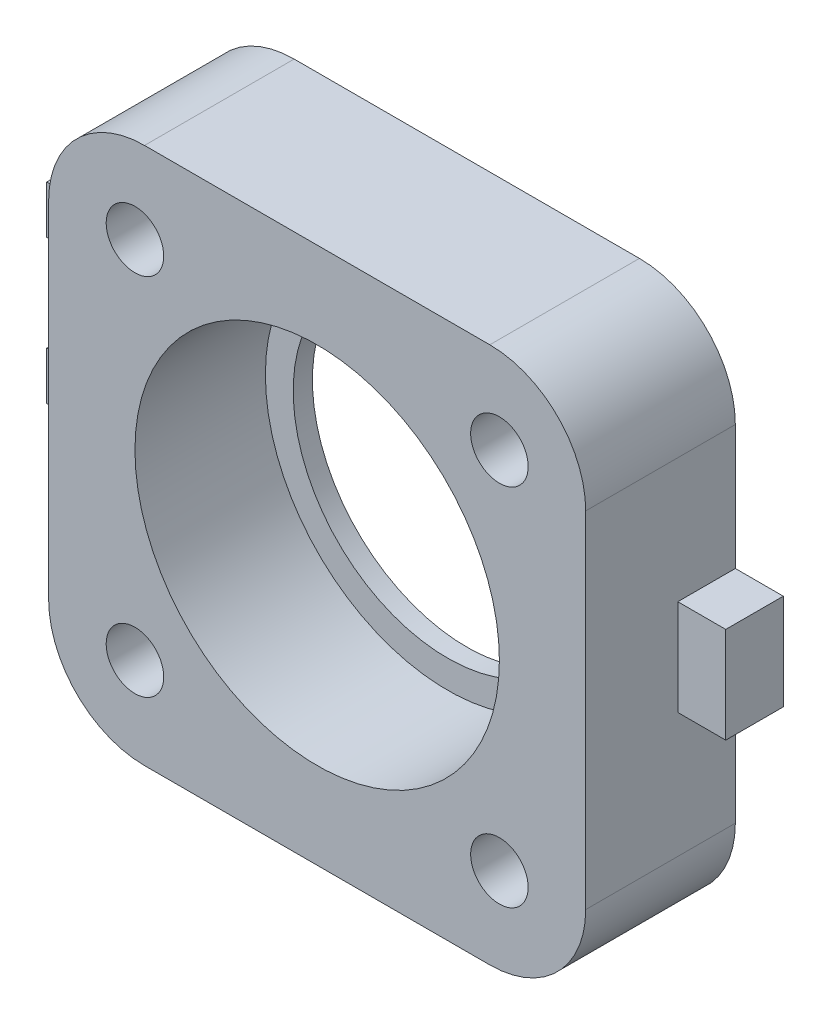
ISO-10303-21;
HEADER;
FILE_DESCRIPTION(('STEP AP214'),'2;1');
FILE_NAME('part.step','',(''),(''),'','','');
FILE_SCHEMA(('AUTOMOTIVE_DESIGN { 1 0 10303 214 1 1 1 1 }'));
ENDSEC;
DATA;
#1=APPLICATION_CONTEXT('core data for automotive mechanical design processes');
#2=APPLICATION_PROTOCOL_DEFINITION('international standard','automotive_design',2000,#1);
#3=PRODUCT_CONTEXT('',#1,'mechanical');
#4=PRODUCT('Part','Part','',(#3));
#5=PRODUCT_RELATED_PRODUCT_CATEGORY('part','',(#4));
#6=PRODUCT_DEFINITION_FORMATION('','',#4);
#7=PRODUCT_DEFINITION_CONTEXT('part definition',#1,'design');
#8=PRODUCT_DEFINITION('design','',#6,#7);
#9=PRODUCT_DEFINITION_SHAPE('','',#8);
#10=(LENGTH_UNIT() NAMED_UNIT(*) SI_UNIT(.MILLI.,.METRE.));
#11=(NAMED_UNIT(*) PLANE_ANGLE_UNIT() SI_UNIT($,.RADIAN.));
#12=(NAMED_UNIT(*) SI_UNIT($,.STERADIAN.) SOLID_ANGLE_UNIT());
#13=UNCERTAINTY_MEASURE_WITH_UNIT(LENGTH_MEASURE(1.E-05),#10,'distance_accuracy_value','');
#14=(GEOMETRIC_REPRESENTATION_CONTEXT(3) GLOBAL_UNCERTAINTY_ASSIGNED_CONTEXT((#13)) GLOBAL_UNIT_ASSIGNED_CONTEXT((#10,
#11,#12)) REPRESENTATION_CONTEXT('',''));
#15=CARTESIAN_POINT('',(0.,0.,0.));
#16=DIRECTION('',(0.,0.,1.));
#17=DIRECTION('',(1.,0.,0.));
#18=AXIS2_PLACEMENT_3D('',#15,#16,#17);
#19=CARTESIAN_POINT('',(-14.,-14.,0.5));
#20=DIRECTION('',(1.,0.,0.));
#21=DIRECTION('',(0.,0.,-1.));
#22=AXIS2_PLACEMENT_3D('',#19,#20,#21);
#23=PLANE('',#22);
#24=DIRECTION('',(0.,-1.,0.));
#25=VECTOR('',#24,1.);
#26=CARTESIAN_POINT('',(-14.,-14.,-0.5));
#27=LINE('',#26,#25);
#28=CARTESIAN_POINT('',(-14.,-5.,-0.5));
#29=VERTEX_POINT('',#28);
#30=CARTESIAN_POINT('',(-14.,-9.,-0.5));
#31=VERTEX_POINT('',#30);
#32=EDGE_CURVE('E421',#29,#31,#27,.T.);
#33=ORIENTED_EDGE('',*,*,#32,.T.);
#34=DIRECTION('',(0.,0.,-1.));
#35=VECTOR('',#34,1.);
#36=CARTESIAN_POINT('',(-14.,-9.,0.5));
#37=LINE('',#36,#35);
#38=CARTESIAN_POINT('',(-14.,-9.,7.3));
#39=VERTEX_POINT('',#38);
#40=EDGE_CURVE('E452',#31,#39,#37,.F.);
#41=ORIENTED_EDGE('',*,*,#40,.T.);
#42=DIRECTION('',(0.,-1.,0.));
#43=VECTOR('',#42,1.);
#44=CARTESIAN_POINT('',(-14.,14.,7.3));
#45=LINE('',#44,#43);
#46=CARTESIAN_POINT('',(-14.,9.,7.3));
#47=VERTEX_POINT('',#46);
#48=EDGE_CURVE('E402',#47,#39,#45,.T.);
#49=ORIENTED_EDGE('',*,*,#48,.F.);
#50=DIRECTION('',(0.,0.,-1.));
#51=VECTOR('',#50,1.);
#52=CARTESIAN_POINT('',(-14.,9.,0.5));
#53=LINE('',#52,#51);
#54=CARTESIAN_POINT('',(-14.,9.,-0.5));
#55=VERTEX_POINT('',#54);
#56=EDGE_CURVE('E448',#47,#55,#53,.T.);
#57=ORIENTED_EDGE('',*,*,#56,.T.);
#58=CARTESIAN_POINT('',(-14.,5.,-0.5));
#59=VERTEX_POINT('',#58);
#60=EDGE_CURVE('E422',#55,#59,#27,.T.);
#61=ORIENTED_EDGE('',*,*,#60,.T.);
#62=DIRECTION('',(0.,0.,-1.));
#63=VECTOR('',#62,1.);
#64=CARTESIAN_POINT('',(-14.,5.,2.5));
#65=LINE('',#64,#63);
#66=CARTESIAN_POINT('',(-14.,5.,2.5));
#67=VERTEX_POINT('',#66);
#68=EDGE_CURVE('E293',#67,#59,#65,.T.);
#69=ORIENTED_EDGE('',*,*,#68,.F.);
#70=DIRECTION('',(0.,1.,0.));
#71=VECTOR('',#70,1.);
#72=CARTESIAN_POINT('',(-14.,0.,2.5));
#73=LINE('',#72,#71);
#74=CARTESIAN_POINT('',(-14.,-5.,2.5));
#75=VERTEX_POINT('',#74);
#76=EDGE_CURVE('E254',#75,#67,#73,.T.);
#77=ORIENTED_EDGE('',*,*,#76,.F.);
#78=DIRECTION('',(0.,0.,-1.));
#79=VECTOR('',#78,1.);
#80=CARTESIAN_POINT('',(-14.,-5.,2.5));
#81=LINE('',#80,#79);
#82=EDGE_CURVE('E289',#75,#29,#81,.T.);
#83=ORIENTED_EDGE('',*,*,#82,.T.);
#84=EDGE_LOOP('',(#33,#41,#49,#57,#61,#69,#77,#83));
#85=FACE_BOUND('',#84,.T.);
#86=ADVANCED_FACE('F41',(#85),#23,.F.);
#87=CARTESIAN_POINT('',(-14.,-14.,0.5));
#88=DIRECTION('',(0.,1.,0.));
#89=DIRECTION('',(0.,0.,1.));
#90=AXIS2_PLACEMENT_3D('',#87,#88,#89);
#91=PLANE('',#90);
#92=DIRECTION('',(1.,0.,0.));
#93=VECTOR('',#92,1.);
#94=CARTESIAN_POINT('',(-14.,-14.,7.3));
#95=LINE('',#94,#93);
#96=CARTESIAN_POINT('',(-9.,-14.,7.3));
#97=VERTEX_POINT('',#96);
#98=CARTESIAN_POINT('',(9.,-14.,7.3));
#99=VERTEX_POINT('',#98);
#100=EDGE_CURVE('E389',#97,#99,#95,.T.);
#101=ORIENTED_EDGE('',*,*,#100,.F.);
#102=DIRECTION('',(0.,0.,-1.));
#103=VECTOR('',#102,1.);
#104=CARTESIAN_POINT('',(-9.,-14.,0.5));
#105=LINE('',#104,#103);
#106=CARTESIAN_POINT('',(-9.,-14.,-0.5));
#107=VERTEX_POINT('',#106);
#108=EDGE_CURVE('E432',#97,#107,#105,.T.);
#109=ORIENTED_EDGE('',*,*,#108,.T.);
#110=DIRECTION('',(1.,0.,0.));
#111=VECTOR('',#110,1.);
#112=CARTESIAN_POINT('',(-14.,-14.,-0.5));
#113=LINE('',#112,#111);
#114=CARTESIAN_POINT('',(-5.,-14.,-0.5));
#115=VERTEX_POINT('',#114);
#116=EDGE_CURVE('E426',#107,#115,#113,.T.);
#117=ORIENTED_EDGE('',*,*,#116,.T.);
#118=DIRECTION('',(0.,0.,-1.));
#119=VECTOR('',#118,1.);
#120=CARTESIAN_POINT('',(-5.,-14.,2.5));
#121=LINE('',#120,#119);
#122=CARTESIAN_POINT('',(-5.,-14.,2.5));
#123=VERTEX_POINT('',#122);
#124=EDGE_CURVE('E320',#123,#115,#121,.T.);
#125=ORIENTED_EDGE('',*,*,#124,.F.);
#126=DIRECTION('',(-1.,0.,0.));
#127=VECTOR('',#126,1.);
#128=CARTESIAN_POINT('',(0.,-14.,2.5));
#129=LINE('',#128,#127);
#130=CARTESIAN_POINT('',(5.,-14.,2.5));
#131=VERTEX_POINT('',#130);
#132=EDGE_CURVE('E308',#131,#123,#129,.T.);
#133=ORIENTED_EDGE('',*,*,#132,.F.);
#134=DIRECTION('',(0.,0.,-1.));
#135=VECTOR('',#134,1.);
#136=CARTESIAN_POINT('',(5.,-14.,2.5));
#137=LINE('',#136,#135);
#138=CARTESIAN_POINT('',(5.,-14.,-0.5));
#139=VERTEX_POINT('',#138);
#140=EDGE_CURVE('E338',#131,#139,#137,.T.);
#141=ORIENTED_EDGE('',*,*,#140,.T.);
#142=CARTESIAN_POINT('',(9.,-14.,-0.5));
#143=VERTEX_POINT('',#142);
#144=EDGE_CURVE('E425',#139,#143,#113,.T.);
#145=ORIENTED_EDGE('',*,*,#144,.T.);
#146=DIRECTION('',(0.,0.,-1.));
#147=VECTOR('',#146,1.);
#148=CARTESIAN_POINT('',(9.,-14.,0.5));
#149=LINE('',#148,#147);
#150=EDGE_CURVE('E429',#143,#99,#149,.F.);
#151=ORIENTED_EDGE('',*,*,#150,.T.);
#152=EDGE_LOOP('',(#101,#109,#117,#125,#133,#141,#145,#151));
#153=FACE_BOUND('',#152,.T.);
#154=ADVANCED_FACE('F528',(#153),#91,.F.);
#155=CARTESIAN_POINT('',(14.,-14.,0.5));
#156=DIRECTION('',(-1.,0.,0.));
#157=DIRECTION('',(0.,0.,1.));
#158=AXIS2_PLACEMENT_3D('',#155,#156,#157);
#159=PLANE('',#158);
#160=DIRECTION('',(0.,1.,0.));
#161=VECTOR('',#160,1.);
#162=CARTESIAN_POINT('',(14.,-14.,7.3));
#163=LINE('',#162,#161);
#164=CARTESIAN_POINT('',(14.,-9.,7.3));
#165=VERTEX_POINT('',#164);
#166=CARTESIAN_POINT('',(14.,9.,7.3));
#167=VERTEX_POINT('',#166);
#168=EDGE_CURVE('E396',#165,#167,#163,.T.);
#169=ORIENTED_EDGE('',*,*,#168,.F.);
#170=DIRECTION('',(0.,0.,-1.));
#171=VECTOR('',#170,1.);
#172=CARTESIAN_POINT('',(14.,-9.,0.5));
#173=LINE('',#172,#171);
#174=CARTESIAN_POINT('',(14.,-9.,-0.5));
#175=VERTEX_POINT('',#174);
#176=EDGE_CURVE('E469',#165,#175,#173,.T.);
#177=ORIENTED_EDGE('',*,*,#176,.T.);
#178=DIRECTION('',(0.,1.,0.));
#179=VECTOR('',#178,1.);
#180=CARTESIAN_POINT('',(14.,-14.,-0.5));
#181=LINE('',#180,#179);
#182=CARTESIAN_POINT('',(14.,-2.5,-0.5));
#183=VERTEX_POINT('',#182);
#184=EDGE_CURVE('E415',#175,#183,#181,.T.);
#185=ORIENTED_EDGE('',*,*,#184,.T.);
#186=DIRECTION('',(0.,0.,-1.));
#187=VECTOR('',#186,1.);
#188=CARTESIAN_POINT('',(14.,-2.5,2.5));
#189=LINE('',#188,#187);
#190=CARTESIAN_POINT('',(14.,-2.5,2.5));
#191=VERTEX_POINT('',#190);
#192=EDGE_CURVE('E376',#191,#183,#189,.T.);
#193=ORIENTED_EDGE('',*,*,#192,.F.);
#194=DIRECTION('',(0.,-1.,0.));
#195=VECTOR('',#194,1.);
#196=CARTESIAN_POINT('',(14.,0.,2.5));
#197=LINE('',#196,#195);
#198=CARTESIAN_POINT('',(14.,2.5,2.5));
#199=VERTEX_POINT('',#198);
#200=EDGE_CURVE('E357',#199,#191,#197,.T.);
#201=ORIENTED_EDGE('',*,*,#200,.F.);
#202=DIRECTION('',(0.,0.,-1.));
#203=VECTOR('',#202,1.);
#204=CARTESIAN_POINT('',(14.,2.5,2.5));
#205=LINE('',#204,#203);
#206=CARTESIAN_POINT('',(14.,2.5,-0.5));
#207=VERTEX_POINT('',#206);
#208=EDGE_CURVE('E371',#199,#207,#205,.T.);
#209=ORIENTED_EDGE('',*,*,#208,.T.);
#210=CARTESIAN_POINT('',(14.,9.,-0.5));
#211=VERTEX_POINT('',#210);
#212=EDGE_CURVE('E411',#207,#211,#181,.T.);
#213=ORIENTED_EDGE('',*,*,#212,.T.);
#214=DIRECTION('',(0.,0.,-1.));
#215=VECTOR('',#214,1.);
#216=CARTESIAN_POINT('',(14.,9.,0.5));
#217=LINE('',#216,#215);
#218=EDGE_CURVE('E466',#211,#167,#217,.F.);
#219=ORIENTED_EDGE('',*,*,#218,.T.);
#220=EDGE_LOOP('',(#169,#177,#185,#193,#201,#209,#213,#219));
#221=FACE_BOUND('',#220,.T.);
#222=ADVANCED_FACE('F518',(#221),#159,.F.);
#223=CARTESIAN_POINT('',(0.,0.,0.5));
#224=DIRECTION('',(0.,0.,-1.));
#225=DIRECTION('',(-1.,0.,0.));
#226=AXIS2_PLACEMENT_3D('',#223,#224,#225);
#227=PLANE('',#226);
#228=CARTESIAN_POINT('',(0.,0.,0.5));
#229=DIRECTION('',(0.,0.,1.));
#230=DIRECTION('',(1.,0.,0.));
#231=AXIS2_PLACEMENT_3D('',#228,#229,#230);
#232=CIRCLE('',#231,8.05);
#233=CARTESIAN_POINT('',(8.05,0.,0.5));
#234=VERTEX_POINT('',#233);
#235=EDGE_CURVE('E407',#234,#234,#232,.T.);
#236=ORIENTED_EDGE('',*,*,#235,.F.);
#237=EDGE_LOOP('',(#236));
#238=FACE_BOUND('',#237,.T.);
#239=CARTESIAN_POINT('',(0.,0.,0.5));
#240=DIRECTION('',(0.,0.,1.));
#241=DIRECTION('',(1.,0.,0.));
#242=AXIS2_PLACEMENT_3D('',#239,#240,#241);
#243=CIRCLE('',#242,9.5);
#244=CARTESIAN_POINT('',(9.5,0.,0.5));
#245=VERTEX_POINT('',#244);
#246=EDGE_CURVE('E375',#245,#245,#243,.T.);
#247=ORIENTED_EDGE('',*,*,#246,.T.);
#248=EDGE_LOOP('',(#247));
#249=FACE_BOUND('',#248,.T.);
#250=ADVANCED_FACE('F515',(#238,#249),#227,.F.);
#251=CARTESIAN_POINT('',(0.,0.,-0.5));
#252=DIRECTION('',(0.,0.,-1.));
#253=DIRECTION('',(-1.,0.,0.));
#254=AXIS2_PLACEMENT_3D('',#251,#252,#253);
#255=PLANE('',#254);
#256=CARTESIAN_POINT('',(9.49999999999999,-9.50000000000001,-0.5));
#257=DIRECTION('',(0.,0.,-1.));
#258=DIRECTION('',(-1.,0.,0.));
#259=AXIS2_PLACEMENT_3D('',#256,#257,#258);
#260=CIRCLE('',#259,1.5);
#261=CARTESIAN_POINT('',(7.99999999999999,-9.50000000000001,-0.5));
#262=VERTEX_POINT('',#261);
#263=EDGE_CURVE('E888',#262,#262,#260,.T.);
#264=ORIENTED_EDGE('',*,*,#263,.F.);
#265=EDGE_LOOP('',(#264));
#266=FACE_BOUND('',#265,.T.);
#267=CARTESIAN_POINT('',(-9.5,-9.5,-0.5));
#268=DIRECTION('',(0.,0.,-1.));
#269=DIRECTION('',(-1.,0.,0.));
#270=AXIS2_PLACEMENT_3D('',#267,#268,#269);
#271=CIRCLE('',#270,1.5);
#272=CARTESIAN_POINT('',(-11.,-9.5,-0.5));
#273=VERTEX_POINT('',#272);
#274=EDGE_CURVE('E884',#273,#273,#271,.T.);
#275=ORIENTED_EDGE('',*,*,#274,.F.);
#276=EDGE_LOOP('',(#275));
#277=FACE_BOUND('',#276,.T.);
#278=CARTESIAN_POINT('',(-9.5,9.5,-0.5));
#279=DIRECTION('',(0.,0.,-1.));
#280=DIRECTION('',(-1.,0.,0.));
#281=AXIS2_PLACEMENT_3D('',#278,#279,#280);
#282=CIRCLE('',#281,1.5);
#283=CARTESIAN_POINT('',(-11.,9.5,-0.5));
#284=VERTEX_POINT('',#283);
#285=EDGE_CURVE('E887',#284,#284,#282,.T.);
#286=ORIENTED_EDGE('',*,*,#285,.F.);
#287=EDGE_LOOP('',(#286));
#288=FACE_BOUND('',#287,.T.);
#289=CARTESIAN_POINT('',(9.5,9.49999999999999,-0.5));
#290=DIRECTION('',(0.,0.,-1.));
#291=DIRECTION('',(-1.,0.,0.));
#292=AXIS2_PLACEMENT_3D('',#289,#290,#291);
#293=CIRCLE('',#292,1.5);
#294=CARTESIAN_POINT('',(8.,9.49999999999999,-0.5));
#295=VERTEX_POINT('',#294);
#296=EDGE_CURVE('E242',#295,#295,#293,.T.);
#297=ORIENTED_EDGE('',*,*,#296,.F.);
#298=EDGE_LOOP('',(#297));
#299=FACE_BOUND('',#298,.T.);
#300=ORIENTED_EDGE('',*,*,#116,.F.);
#301=CARTESIAN_POINT('',(-9.,-9.,-0.5));
#302=DIRECTION('',(0.,0.,-1.));
#303=DIRECTION('',(-1.,0.,0.));
#304=AXIS2_PLACEMENT_3D('',#301,#302,#303);
#305=CIRCLE('',#304,5.);
#306=EDGE_CURVE('E445',#107,#31,#305,.T.);
#307=ORIENTED_EDGE('',*,*,#306,.T.);
#308=ORIENTED_EDGE('',*,*,#32,.F.);
#309=DIRECTION('',(-1.,0.,0.));
#310=VECTOR('',#309,1.);
#311=CARTESIAN_POINT('',(0.,-5.,-0.5));
#312=LINE('',#311,#310);
#313=CARTESIAN_POINT('',(-18.9,-5.,-0.5));
#314=VERTEX_POINT('',#313);
#315=EDGE_CURVE('E239',#29,#314,#312,.T.);
#316=ORIENTED_EDGE('',*,*,#315,.T.);
#317=DIRECTION('',(0.,-1.,0.));
#318=VECTOR('',#317,1.);
#319=CARTESIAN_POINT('',(-18.9,0.,-0.5));
#320=LINE('',#319,#318);
#321=CARTESIAN_POINT('',(-18.9,-2.5,-0.5));
#322=VERTEX_POINT('',#321);
#323=EDGE_CURVE('E235',#322,#314,#320,.T.);
#324=ORIENTED_EDGE('',*,*,#323,.F.);
#325=DIRECTION('',(-1.,0.,0.));
#326=VECTOR('',#325,1.);
#327=CARTESIAN_POINT('',(0.,-2.5,-0.5));
#328=LINE('',#327,#326);
#329=CARTESIAN_POINT('',(-16.5,-2.5,-0.5));
#330=VERTEX_POINT('',#329);
#331=EDGE_CURVE('E263',#330,#322,#328,.T.);
#332=ORIENTED_EDGE('',*,*,#331,.F.);
#333=DIRECTION('',(0.,-1.,0.));
#334=VECTOR('',#333,1.);
#335=CARTESIAN_POINT('',(-16.5,0.,-0.5));
#336=LINE('',#335,#334);
#337=CARTESIAN_POINT('',(-16.5,2.5,-0.5));
#338=VERTEX_POINT('',#337);
#339=EDGE_CURVE('E223',#338,#330,#336,.T.);
#340=ORIENTED_EDGE('',*,*,#339,.F.);
#341=DIRECTION('',(-1.,0.,0.));
#342=VECTOR('',#341,1.);
#343=CARTESIAN_POINT('',(0.,2.5,-0.5));
#344=LINE('',#343,#342);
#345=CARTESIAN_POINT('',(-18.9,2.5,-0.5));
#346=VERTEX_POINT('',#345);
#347=EDGE_CURVE('E268',#338,#346,#344,.T.);
#348=ORIENTED_EDGE('',*,*,#347,.T.);
#349=DIRECTION('',(0.,1.,0.));
#350=VECTOR('',#349,1.);
#351=CARTESIAN_POINT('',(-18.9,0.,-0.5));
#352=LINE('',#351,#350);
#353=CARTESIAN_POINT('',(-18.9,5.,-0.5));
#354=VERTEX_POINT('',#353);
#355=EDGE_CURVE('E272',#346,#354,#352,.T.);
#356=ORIENTED_EDGE('',*,*,#355,.T.);
#357=DIRECTION('',(-1.,0.,0.));
#358=VECTOR('',#357,1.);
#359=CARTESIAN_POINT('',(0.,5.,-0.5));
#360=LINE('',#359,#358);
#361=EDGE_CURVE('E276',#59,#354,#360,.T.);
#362=ORIENTED_EDGE('',*,*,#361,.F.);
#363=ORIENTED_EDGE('',*,*,#60,.F.);
#364=CARTESIAN_POINT('',(-9.,9.,-0.5));
#365=DIRECTION('',(0.,0.,-1.));
#366=DIRECTION('',(-1.,0.,0.));
#367=AXIS2_PLACEMENT_3D('',#364,#365,#366);
#368=CIRCLE('',#367,5.);
#369=CARTESIAN_POINT('',(-9.,14.,-0.5));
#370=VERTEX_POINT('',#369);
#371=EDGE_CURVE('E436',#55,#370,#368,.T.);
#372=ORIENTED_EDGE('',*,*,#371,.T.);
#373=DIRECTION('',(-1.,0.,0.));
#374=VECTOR('',#373,1.);
#375=CARTESIAN_POINT('',(-14.,14.,-0.5));
#376=LINE('',#375,#374);
#377=CARTESIAN_POINT('',(9.,14.,-0.5));
#378=VERTEX_POINT('',#377);
#379=EDGE_CURVE('E418',#378,#370,#376,.T.);
#380=ORIENTED_EDGE('',*,*,#379,.F.);
#381=CARTESIAN_POINT('',(9.,9.,-0.5));
#382=DIRECTION('',(0.,0.,-1.));
#383=DIRECTION('',(-1.,0.,0.));
#384=AXIS2_PLACEMENT_3D('',#381,#382,#383);
#385=CIRCLE('',#384,5.);
#386=EDGE_CURVE('E439',#378,#211,#385,.T.);
#387=ORIENTED_EDGE('',*,*,#386,.T.);
#388=ORIENTED_EDGE('',*,*,#212,.F.);
#389=DIRECTION('',(1.,0.,0.));
#390=VECTOR('',#389,1.);
#391=CARTESIAN_POINT('',(0.,2.50000000000003,-0.5));
#392=LINE('',#391,#390);
#393=CARTESIAN_POINT('',(16.5,2.5,-0.5));
#394=VERTEX_POINT('',#393);
#395=EDGE_CURVE('E334',#207,#394,#392,.T.);
#396=ORIENTED_EDGE('',*,*,#395,.T.);
#397=DIRECTION('',(0.,-1.,0.));
#398=VECTOR('',#397,1.);
#399=CARTESIAN_POINT('',(16.5,0.,-0.5));
#400=LINE('',#399,#398);
#401=CARTESIAN_POINT('',(16.5,-2.5,-0.5));
#402=VERTEX_POINT('',#401);
#403=EDGE_CURVE('E364',#394,#402,#400,.T.);
#404=ORIENTED_EDGE('',*,*,#403,.T.);
#405=DIRECTION('',(1.,0.,0.));
#406=VECTOR('',#405,1.);
#407=CARTESIAN_POINT('',(0.,-2.5,-0.5));
#408=LINE('',#407,#406);
#409=EDGE_CURVE('E350',#183,#402,#408,.T.);
#410=ORIENTED_EDGE('',*,*,#409,.F.);
#411=ORIENTED_EDGE('',*,*,#184,.F.);
#412=CARTESIAN_POINT('',(9.,-9.,-0.5));
#413=DIRECTION('',(0.,0.,-1.));
#414=DIRECTION('',(-1.,0.,0.));
#415=AXIS2_PLACEMENT_3D('',#412,#413,#414);
#416=CIRCLE('',#415,5.);
#417=EDGE_CURVE('E442',#175,#143,#416,.T.);
#418=ORIENTED_EDGE('',*,*,#417,.T.);
#419=ORIENTED_EDGE('',*,*,#144,.F.);
#420=DIRECTION('',(0.,-1.,0.));
#421=VECTOR('',#420,1.);
#422=CARTESIAN_POINT('',(5.,0.,-0.5));
#423=LINE('',#422,#421);
#424=CARTESIAN_POINT('',(4.99999999999999,-18.,-0.5));
#425=VERTEX_POINT('',#424);
#426=EDGE_CURVE('E324',#139,#425,#423,.T.);
#427=ORIENTED_EDGE('',*,*,#426,.T.);
#428=DIRECTION('',(-1.,0.,0.));
#429=VECTOR('',#428,1.);
#430=CARTESIAN_POINT('',(0.,-18.,-0.5));
#431=LINE('',#430,#429);
#432=CARTESIAN_POINT('',(-5.00000000000001,-18.,-0.5));
#433=VERTEX_POINT('',#432);
#434=EDGE_CURVE('E309',#425,#433,#431,.T.);
#435=ORIENTED_EDGE('',*,*,#434,.T.);
#436=DIRECTION('',(0.,-1.,0.));
#437=VECTOR('',#436,1.);
#438=CARTESIAN_POINT('',(-5.,0.,-0.5));
#439=LINE('',#438,#437);
#440=EDGE_CURVE('E285',#115,#433,#439,.T.);
#441=ORIENTED_EDGE('',*,*,#440,.F.);
#442=EDGE_LOOP('',(#300,#307,#308,#316,#324,#332,#340,#348,#356,#362,#363,#372,#380,#387,#388,
#396,#404,#410,#411,#418,#419,#427,#435,#441));
#443=FACE_BOUND('',#442,.T.);
#444=CARTESIAN_POINT('',(0.,0.,-0.5));
#445=DIRECTION('',(0.,0.,1.));
#446=DIRECTION('',(1.,0.,0.));
#447=AXIS2_PLACEMENT_3D('',#444,#445,#446);
#448=CIRCLE('',#447,8.05);
#449=CARTESIAN_POINT('',(8.05,0.,-0.5));
#450=VERTEX_POINT('',#449);
#451=EDGE_CURVE('E406',#450,#450,#448,.T.);
#452=ORIENTED_EDGE('',*,*,#451,.T.);
#453=EDGE_LOOP('',(#452));
#454=FACE_BOUND('',#453,.T.);
#455=ADVANCED_FACE('F517',(#266,#277,#288,#299,#443,#454),#255,.T.);
#456=CARTESIAN_POINT('',(-14.,14.,0.5));
#457=DIRECTION('',(0.,-1.,0.));
#458=DIRECTION('',(0.,0.,-1.));
#459=AXIS2_PLACEMENT_3D('',#456,#457,#458);
#460=PLANE('',#459);
#461=DIRECTION('',(-1.,0.,0.));
#462=VECTOR('',#461,1.);
#463=CARTESIAN_POINT('',(14.,14.,7.3));
#464=LINE('',#463,#462);
#465=CARTESIAN_POINT('',(9.,14.,7.3));
#466=VERTEX_POINT('',#465);
#467=CARTESIAN_POINT('',(-9.,14.,7.3));
#468=VERTEX_POINT('',#467);
#469=EDGE_CURVE('E399',#466,#468,#464,.T.);
#470=ORIENTED_EDGE('',*,*,#469,.F.);
#471=DIRECTION('',(0.,0.,-1.));
#472=VECTOR('',#471,1.);
#473=CARTESIAN_POINT('',(9.,14.,0.5));
#474=LINE('',#473,#472);
#475=EDGE_CURVE('E11',#466,#378,#474,.T.);
#476=ORIENTED_EDGE('',*,*,#475,.T.);
#477=ORIENTED_EDGE('',*,*,#379,.T.);
#478=DIRECTION('',(0.,0.,-1.));
#479=VECTOR('',#478,1.);
#480=CARTESIAN_POINT('',(-9.,14.,0.5));
#481=LINE('',#480,#479);
#482=EDGE_CURVE('E51',#370,#468,#481,.F.);
#483=ORIENTED_EDGE('',*,*,#482,.T.);
#484=EDGE_LOOP('',(#470,#476,#477,#483));
#485=FACE_BOUND('',#484,.T.);
#486=ADVANCED_FACE('F525',(#485),#460,.F.);
#487=CARTESIAN_POINT('',(0.,0.,0.5));
#488=DIRECTION('',(0.,0.,-1.));
#489=DIRECTION('',(-1.,0.,0.));
#490=AXIS2_PLACEMENT_3D('',#487,#488,#489);
#491=CYLINDRICAL_SURFACE('',#490,8.05);
#492=ORIENTED_EDGE('',*,*,#235,.T.);
#493=EDGE_LOOP('',(#492));
#494=FACE_BOUND('',#493,.T.);
#495=ORIENTED_EDGE('',*,*,#451,.F.);
#496=EDGE_LOOP('',(#495));
#497=FACE_BOUND('',#496,.T.);
#498=ADVANCED_FACE('F498',(#494,#497),#491,.F.);
#499=CARTESIAN_POINT('',(0.,0.,7.3));
#500=DIRECTION('',(0.,0.,1.));
#501=DIRECTION('',(1.,0.,0.));
#502=AXIS2_PLACEMENT_3D('',#499,#500,#501);
#503=PLANE('',#502);
#504=CARTESIAN_POINT('',(9.49999999999999,-9.50000000000001,7.3));
#505=DIRECTION('',(0.,0.,1.));
#506=DIRECTION('',(1.,0.,0.));
#507=AXIS2_PLACEMENT_3D('',#504,#505,#506);
#508=CIRCLE('',#507,1.5);
#509=CARTESIAN_POINT('',(11.,-9.50000000000001,7.3));
#510=VERTEX_POINT('',#509);
#511=EDGE_CURVE('E45',#510,#510,#508,.T.);
#512=ORIENTED_EDGE('',*,*,#511,.F.);
#513=EDGE_LOOP('',(#512));
#514=FACE_BOUND('',#513,.T.);
#515=CARTESIAN_POINT('',(-9.5,-9.5,7.3));
#516=DIRECTION('',(0.,0.,1.));
#517=DIRECTION('',(1.,0.,0.));
#518=AXIS2_PLACEMENT_3D('',#515,#516,#517);
#519=CIRCLE('',#518,1.5);
#520=CARTESIAN_POINT('',(-8.,-9.5,7.3));
#521=VERTEX_POINT('',#520);
#522=EDGE_CURVE('E482',#521,#521,#519,.T.);
#523=ORIENTED_EDGE('',*,*,#522,.F.);
#524=EDGE_LOOP('',(#523));
#525=FACE_BOUND('',#524,.T.);
#526=CARTESIAN_POINT('',(-9.5,9.5,7.3));
#527=DIRECTION('',(0.,0.,1.));
#528=DIRECTION('',(1.,0.,0.));
#529=AXIS2_PLACEMENT_3D('',#526,#527,#528);
#530=CIRCLE('',#529,1.5);
#531=CARTESIAN_POINT('',(-8.,9.5,7.3));
#532=VERTEX_POINT('',#531);
#533=EDGE_CURVE('E479',#532,#532,#530,.T.);
#534=ORIENTED_EDGE('',*,*,#533,.F.);
#535=EDGE_LOOP('',(#534));
#536=FACE_BOUND('',#535,.T.);
#537=CARTESIAN_POINT('',(9.5,9.49999999999999,7.3));
#538=DIRECTION('',(0.,0.,1.));
#539=DIRECTION('',(1.,0.,0.));
#540=AXIS2_PLACEMENT_3D('',#537,#538,#539);
#541=CIRCLE('',#540,1.5);
#542=CARTESIAN_POINT('',(11.,9.49999999999999,7.3));
#543=VERTEX_POINT('',#542);
#544=EDGE_CURVE('E475',#543,#543,#541,.T.);
#545=ORIENTED_EDGE('',*,*,#544,.F.);
#546=EDGE_LOOP('',(#545));
#547=FACE_BOUND('',#546,.T.);
#548=ORIENTED_EDGE('',*,*,#48,.T.);
#549=CARTESIAN_POINT('',(-9.,-9.,7.3));
#550=DIRECTION('',(0.,0.,1.));
#551=DIRECTION('',(1.,0.,0.));
#552=AXIS2_PLACEMENT_3D('',#549,#550,#551);
#553=CIRCLE('',#552,5.);
#554=EDGE_CURVE('E463',#39,#97,#553,.T.);
#555=ORIENTED_EDGE('',*,*,#554,.T.);
#556=ORIENTED_EDGE('',*,*,#100,.T.);
#557=CARTESIAN_POINT('',(9.,-9.,7.3));
#558=DIRECTION('',(0.,0.,1.));
#559=DIRECTION('',(1.,0.,0.));
#560=AXIS2_PLACEMENT_3D('',#557,#558,#559);
#561=CIRCLE('',#560,5.);
#562=EDGE_CURVE('E460',#99,#165,#561,.T.);
#563=ORIENTED_EDGE('',*,*,#562,.T.);
#564=ORIENTED_EDGE('',*,*,#168,.T.);
#565=CARTESIAN_POINT('',(9.,9.,7.3));
#566=DIRECTION('',(0.,0.,1.));
#567=DIRECTION('',(1.,0.,0.));
#568=AXIS2_PLACEMENT_3D('',#565,#566,#567);
#569=CIRCLE('',#568,5.);
#570=EDGE_CURVE('E65',#167,#466,#569,.T.);
#571=ORIENTED_EDGE('',*,*,#570,.T.);
#572=ORIENTED_EDGE('',*,*,#469,.T.);
#573=CARTESIAN_POINT('',(-9.,9.,7.3));
#574=DIRECTION('',(0.,0.,1.));
#575=DIRECTION('',(1.,0.,0.));
#576=AXIS2_PLACEMENT_3D('',#573,#574,#575);
#577=CIRCLE('',#576,5.);
#578=EDGE_CURVE('E455',#468,#47,#577,.T.);
#579=ORIENTED_EDGE('',*,*,#578,.T.);
#580=EDGE_LOOP('',(#548,#555,#556,#563,#564,#571,#572,#579));
#581=FACE_BOUND('',#580,.T.);
#582=CARTESIAN_POINT('',(0.,0.,7.3));
#583=DIRECTION('',(0.,0.,1.));
#584=DIRECTION('',(1.,0.,0.));
#585=AXIS2_PLACEMENT_3D('',#582,#583,#584);
#586=CIRCLE('',#585,9.5);
#587=CARTESIAN_POINT('',(9.5,0.,7.3));
#588=VERTEX_POINT('',#587);
#589=EDGE_CURVE('E385',#588,#588,#586,.T.);
#590=ORIENTED_EDGE('',*,*,#589,.F.);
#591=EDGE_LOOP('',(#590));
#592=FACE_BOUND('',#591,.T.);
#593=ADVANCED_FACE('F494',(#514,#525,#536,#547,#581,#592),#503,.T.);
#594=CARTESIAN_POINT('',(0.,0.,7.3));
#595=DIRECTION('',(0.,0.,-1.));
#596=DIRECTION('',(-1.,0.,0.));
#597=AXIS2_PLACEMENT_3D('',#594,#595,#596);
#598=CYLINDRICAL_SURFACE('',#597,9.5);
#599=ORIENTED_EDGE('',*,*,#589,.T.);
#600=EDGE_LOOP('',(#599));
#601=FACE_BOUND('',#600,.T.);
#602=ORIENTED_EDGE('',*,*,#246,.F.);
#603=EDGE_LOOP('',(#602));
#604=FACE_BOUND('',#603,.T.);
#605=ADVANCED_FACE('F497',(#601,#604),#598,.F.);
#606=CARTESIAN_POINT('',(0.,2.50000000000003,2.5));
#607=DIRECTION('',(0.,1.,0.));
#608=DIRECTION('',(-1.,0.,0.));
#609=AXIS2_PLACEMENT_3D('',#606,#607,#608);
#610=PLANE('',#609);
#611=ORIENTED_EDGE('',*,*,#395,.F.);
#612=ORIENTED_EDGE('',*,*,#208,.F.);
#613=DIRECTION('',(1.,0.,0.));
#614=VECTOR('',#613,1.);
#615=CARTESIAN_POINT('',(0.,2.50000000000003,2.5));
#616=LINE('',#615,#614);
#617=CARTESIAN_POINT('',(16.5,2.5,2.5));
#618=VERTEX_POINT('',#617);
#619=EDGE_CURVE('E345',#199,#618,#616,.T.);
#620=ORIENTED_EDGE('',*,*,#619,.T.);
#621=DIRECTION('',(0.,0.,-1.));
#622=VECTOR('',#621,1.);
#623=CARTESIAN_POINT('',(16.5,2.5,2.5));
#624=LINE('',#623,#622);
#625=EDGE_CURVE('E360',#618,#394,#624,.T.);
#626=ORIENTED_EDGE('',*,*,#625,.T.);
#627=EDGE_LOOP('',(#611,#612,#620,#626));
#628=FACE_BOUND('',#627,.T.);
#629=ADVANCED_FACE('F511',(#628),#610,.T.);
#630=CARTESIAN_POINT('',(0.,-2.5,2.5));
#631=DIRECTION('',(0.,1.,0.));
#632=DIRECTION('',(0.,0.,1.));
#633=AXIS2_PLACEMENT_3D('',#630,#631,#632);
#634=PLANE('',#633);
#635=ORIENTED_EDGE('',*,*,#409,.T.);
#636=DIRECTION('',(0.,0.,-1.));
#637=VECTOR('',#636,1.);
#638=CARTESIAN_POINT('',(16.5,-2.5,2.5));
#639=LINE('',#638,#637);
#640=CARTESIAN_POINT('',(16.5,-2.5,2.5));
#641=VERTEX_POINT('',#640);
#642=EDGE_CURVE('E380',#641,#402,#639,.T.);
#643=ORIENTED_EDGE('',*,*,#642,.F.);
#644=DIRECTION('',(1.,0.,0.));
#645=VECTOR('',#644,1.);
#646=CARTESIAN_POINT('',(0.,-2.5,2.5));
#647=LINE('',#646,#645);
#648=EDGE_CURVE('E354',#191,#641,#647,.T.);
#649=ORIENTED_EDGE('',*,*,#648,.F.);
#650=ORIENTED_EDGE('',*,*,#192,.T.);
#651=EDGE_LOOP('',(#635,#643,#649,#650));
#652=FACE_BOUND('',#651,.T.);
#653=ADVANCED_FACE('F598',(#652),#634,.F.);
#654=CARTESIAN_POINT('',(16.5,0.,2.5));
#655=DIRECTION('',(1.,0.,0.));
#656=DIRECTION('',(0.,0.,-1.));
#657=AXIS2_PLACEMENT_3D('',#654,#655,#656);
#658=PLANE('',#657);
#659=ORIENTED_EDGE('',*,*,#403,.F.);
#660=ORIENTED_EDGE('',*,*,#625,.F.);
#661=DIRECTION('',(0.,-1.,0.));
#662=VECTOR('',#661,1.);
#663=CARTESIAN_POINT('',(16.5,0.,2.5));
#664=LINE('',#663,#662);
#665=EDGE_CURVE('E349',#618,#641,#664,.T.);
#666=ORIENTED_EDGE('',*,*,#665,.T.);
#667=ORIENTED_EDGE('',*,*,#642,.T.);
#668=EDGE_LOOP('',(#659,#660,#666,#667));
#669=FACE_BOUND('',#668,.T.);
#670=ADVANCED_FACE('F594',(#669),#658,.T.);
#671=CARTESIAN_POINT('',(0.,0.,2.5));
#672=DIRECTION('',(0.,0.,-1.));
#673=DIRECTION('',(-1.,0.,0.));
#674=AXIS2_PLACEMENT_3D('',#671,#672,#673);
#675=PLANE('',#674);
#676=ORIENTED_EDGE('',*,*,#619,.F.);
#677=ORIENTED_EDGE('',*,*,#200,.T.);
#678=ORIENTED_EDGE('',*,*,#648,.T.);
#679=ORIENTED_EDGE('',*,*,#665,.F.);
#680=EDGE_LOOP('',(#676,#677,#678,#679));
#681=FACE_BOUND('',#680,.T.);
#682=ADVANCED_FACE('F601',(#681),#675,.F.);
#683=CARTESIAN_POINT('',(-5.,0.,2.5));
#684=DIRECTION('',(1.,0.,0.));
#685=DIRECTION('',(0.,1.,0.));
#686=AXIS2_PLACEMENT_3D('',#683,#684,#685);
#687=PLANE('',#686);
#688=ORIENTED_EDGE('',*,*,#440,.T.);
#689=DIRECTION('',(0.,0.,-1.));
#690=VECTOR('',#689,1.);
#691=CARTESIAN_POINT('',(-5.00000000000001,-18.,2.5));
#692=LINE('',#691,#690);
#693=CARTESIAN_POINT('',(-5.00000000000001,-18.,2.5));
#694=VERTEX_POINT('',#693);
#695=EDGE_CURVE('E331',#694,#433,#692,.T.);
#696=ORIENTED_EDGE('',*,*,#695,.F.);
#697=DIRECTION('',(0.,-1.,0.));
#698=VECTOR('',#697,1.);
#699=CARTESIAN_POINT('',(-5.,0.,2.5));
#700=LINE('',#699,#698);
#701=EDGE_CURVE('E305',#123,#694,#700,.T.);
#702=ORIENTED_EDGE('',*,*,#701,.F.);
#703=ORIENTED_EDGE('',*,*,#124,.T.);
#704=EDGE_LOOP('',(#688,#696,#702,#703));
#705=FACE_BOUND('',#704,.T.);
#706=ADVANCED_FACE('F603',(#705),#687,.F.);
#707=CARTESIAN_POINT('',(0.,-18.,2.5));
#708=DIRECTION('',(0.,-1.,0.));
#709=DIRECTION('',(1.,0.,0.));
#710=AXIS2_PLACEMENT_3D('',#707,#708,#709);
#711=PLANE('',#710);
#712=ORIENTED_EDGE('',*,*,#434,.F.);
#713=DIRECTION('',(0.,0.,-1.));
#714=VECTOR('',#713,1.);
#715=CARTESIAN_POINT('',(4.99999999999999,-18.,2.5));
#716=LINE('',#715,#714);
#717=CARTESIAN_POINT('',(4.99999999999999,-18.,2.5));
#718=VERTEX_POINT('',#717);
#719=EDGE_CURVE('E335',#718,#425,#716,.T.);
#720=ORIENTED_EDGE('',*,*,#719,.F.);
#721=DIRECTION('',(-1.,0.,0.));
#722=VECTOR('',#721,1.);
#723=CARTESIAN_POINT('',(0.,-18.,2.5));
#724=LINE('',#723,#722);
#725=EDGE_CURVE('E316',#718,#694,#724,.T.);
#726=ORIENTED_EDGE('',*,*,#725,.T.);
#727=ORIENTED_EDGE('',*,*,#695,.T.);
#728=EDGE_LOOP('',(#712,#720,#726,#727));
#729=FACE_BOUND('',#728,.T.);
#730=ADVANCED_FACE('F609',(#729),#711,.T.);
#731=CARTESIAN_POINT('',(5.,0.,2.5));
#732=DIRECTION('',(1.,0.,0.));
#733=DIRECTION('',(0.,1.,0.));
#734=AXIS2_PLACEMENT_3D('',#731,#732,#733);
#735=PLANE('',#734);
#736=ORIENTED_EDGE('',*,*,#426,.F.);
#737=ORIENTED_EDGE('',*,*,#140,.F.);
#738=DIRECTION('',(0.,-1.,0.));
#739=VECTOR('',#738,1.);
#740=CARTESIAN_POINT('',(5.,0.,2.5));
#741=LINE('',#740,#739);
#742=EDGE_CURVE('E312',#131,#718,#741,.T.);
#743=ORIENTED_EDGE('',*,*,#742,.T.);
#744=ORIENTED_EDGE('',*,*,#719,.T.);
#745=EDGE_LOOP('',(#736,#737,#743,#744));
#746=FACE_BOUND('',#745,.T.);
#747=ADVANCED_FACE('F667',(#746),#735,.T.);
#748=CARTESIAN_POINT('',(0.,0.,2.5));
#749=DIRECTION('',(0.,0.,-1.));
#750=DIRECTION('',(-1.,0.,0.));
#751=AXIS2_PLACEMENT_3D('',#748,#749,#750);
#752=PLANE('',#751);
#753=ORIENTED_EDGE('',*,*,#701,.T.);
#754=ORIENTED_EDGE('',*,*,#725,.F.);
#755=ORIENTED_EDGE('',*,*,#742,.F.);
#756=ORIENTED_EDGE('',*,*,#132,.T.);
#757=EDGE_LOOP('',(#753,#754,#755,#756));
#758=FACE_BOUND('',#757,.T.);
#759=ADVANCED_FACE('F677',(#758),#752,.F.);
#760=CARTESIAN_POINT('',(0.,-2.5,2.5));
#761=DIRECTION('',(0.,-1.,0.));
#762=DIRECTION('',(1.,0.,0.));
#763=AXIS2_PLACEMENT_3D('',#760,#761,#762);
#764=PLANE('',#763);
#765=ORIENTED_EDGE('',*,*,#331,.T.);
#766=DIRECTION('',(0.,0.,-1.));
#767=VECTOR('',#766,1.);
#768=CARTESIAN_POINT('',(-18.9,-2.5,2.5));
#769=LINE('',#768,#767);
#770=CARTESIAN_POINT('',(-18.9,-2.5,2.5));
#771=VERTEX_POINT('',#770);
#772=EDGE_CURVE('E233',#771,#322,#769,.T.);
#773=ORIENTED_EDGE('',*,*,#772,.F.);
#774=DIRECTION('',(-1.,0.,0.));
#775=VECTOR('',#774,1.);
#776=CARTESIAN_POINT('',(0.,-2.5,2.5));
#777=LINE('',#776,#775);
#778=CARTESIAN_POINT('',(-16.5,-2.5,2.5));
#779=VERTEX_POINT('',#778);
#780=EDGE_CURVE('E211',#779,#771,#777,.T.);
#781=ORIENTED_EDGE('',*,*,#780,.F.);
#782=DIRECTION('',(0.,0.,-1.));
#783=VECTOR('',#782,1.);
#784=CARTESIAN_POINT('',(-16.5,-2.5,2.5));
#785=LINE('',#784,#783);
#786=EDGE_CURVE('E220',#779,#330,#785,.T.);
#787=ORIENTED_EDGE('',*,*,#786,.T.);
#788=EDGE_LOOP('',(#765,#773,#781,#787));
#789=FACE_BOUND('',#788,.T.);
#790=ADVANCED_FACE('F231',(#789),#764,.F.);
#791=CARTESIAN_POINT('',(-18.9,0.,2.5));
#792=DIRECTION('',(1.,0.,0.));
#793=DIRECTION('',(0.,0.,-1.));
#794=AXIS2_PLACEMENT_3D('',#791,#792,#793);
#795=PLANE('',#794);
#796=ORIENTED_EDGE('',*,*,#323,.T.);
#797=DIRECTION('',(0.,0.,-1.));
#798=VECTOR('',#797,1.);
#799=CARTESIAN_POINT('',(-18.9,-5.,2.5));
#800=LINE('',#799,#798);
#801=CARTESIAN_POINT('',(-18.9,-5.,2.5));
#802=VERTEX_POINT('',#801);
#803=EDGE_CURVE('E286',#802,#314,#800,.T.);
#804=ORIENTED_EDGE('',*,*,#803,.F.);
#805=DIRECTION('',(0.,-1.,0.));
#806=VECTOR('',#805,1.);
#807=CARTESIAN_POINT('',(-18.9,0.,2.5));
#808=LINE('',#807,#806);
#809=EDGE_CURVE('E229',#771,#802,#808,.T.);
#810=ORIENTED_EDGE('',*,*,#809,.F.);
#811=ORIENTED_EDGE('',*,*,#772,.T.);
#812=EDGE_LOOP('',(#796,#804,#810,#811));
#813=FACE_BOUND('',#812,.T.);
#814=ADVANCED_FACE('F696',(#813),#795,.F.);
#815=CARTESIAN_POINT('',(0.,-5.,2.5));
#816=DIRECTION('',(0.,-1.,0.));
#817=DIRECTION('',(0.,0.,-1.));
#818=AXIS2_PLACEMENT_3D('',#815,#816,#817);
#819=PLANE('',#818);
#820=ORIENTED_EDGE('',*,*,#315,.F.);
#821=ORIENTED_EDGE('',*,*,#82,.F.);
#822=DIRECTION('',(-1.,0.,0.));
#823=VECTOR('',#822,1.);
#824=CARTESIAN_POINT('',(0.,-5.,2.5));
#825=LINE('',#824,#823);
#826=EDGE_CURVE('E257',#75,#802,#825,.T.);
#827=ORIENTED_EDGE('',*,*,#826,.T.);
#828=ORIENTED_EDGE('',*,*,#803,.T.);
#829=EDGE_LOOP('',(#820,#821,#827,#828));
#830=FACE_BOUND('',#829,.T.);
#831=ADVANCED_FACE('F705',(#830),#819,.T.);
#832=CARTESIAN_POINT('',(0.,5.,2.5));
#833=DIRECTION('',(0.,-1.,0.));
#834=DIRECTION('',(0.,0.,-1.));
#835=AXIS2_PLACEMENT_3D('',#832,#833,#834);
#836=PLANE('',#835);
#837=ORIENTED_EDGE('',*,*,#361,.T.);
#838=DIRECTION('',(0.,0.,-1.));
#839=VECTOR('',#838,1.);
#840=CARTESIAN_POINT('',(-18.9,5.,2.5));
#841=LINE('',#840,#839);
#842=CARTESIAN_POINT('',(-18.9,5.,2.5));
#843=VERTEX_POINT('',#842);
#844=EDGE_CURVE('E297',#843,#354,#841,.T.);
#845=ORIENTED_EDGE('',*,*,#844,.F.);
#846=DIRECTION('',(-1.,0.,0.));
#847=VECTOR('',#846,1.);
#848=CARTESIAN_POINT('',(0.,5.,2.5));
#849=LINE('',#848,#847);
#850=EDGE_CURVE('E251',#67,#843,#849,.T.);
#851=ORIENTED_EDGE('',*,*,#850,.F.);
#852=ORIENTED_EDGE('',*,*,#68,.T.);
#853=EDGE_LOOP('',(#837,#845,#851,#852));
#854=FACE_BOUND('',#853,.T.);
#855=ADVANCED_FACE('F715',(#854),#836,.F.);
#856=CARTESIAN_POINT('',(-18.9,0.,2.5));
#857=DIRECTION('',(-1.,0.,0.));
#858=DIRECTION('',(0.,0.,1.));
#859=AXIS2_PLACEMENT_3D('',#856,#857,#858);
#860=PLANE('',#859);
#861=ORIENTED_EDGE('',*,*,#355,.F.);
#862=DIRECTION('',(0.,0.,-1.));
#863=VECTOR('',#862,1.);
#864=CARTESIAN_POINT('',(-18.9,2.5,2.5));
#865=LINE('',#864,#863);
#866=CARTESIAN_POINT('',(-18.9,2.5,2.5));
#867=VERTEX_POINT('',#866);
#868=EDGE_CURVE('E300',#867,#346,#865,.T.);
#869=ORIENTED_EDGE('',*,*,#868,.F.);
#870=DIRECTION('',(0.,1.,0.));
#871=VECTOR('',#870,1.);
#872=CARTESIAN_POINT('',(-18.9,0.,2.5));
#873=LINE('',#872,#871);
#874=EDGE_CURVE('E247',#867,#843,#873,.T.);
#875=ORIENTED_EDGE('',*,*,#874,.T.);
#876=ORIENTED_EDGE('',*,*,#844,.T.);
#877=EDGE_LOOP('',(#861,#869,#875,#876));
#878=FACE_BOUND('',#877,.T.);
#879=ADVANCED_FACE('F725',(#878),#860,.T.);
#880=CARTESIAN_POINT('',(0.,2.5,2.5));
#881=DIRECTION('',(0.,-1.,0.));
#882=DIRECTION('',(1.,0.,0.));
#883=AXIS2_PLACEMENT_3D('',#880,#881,#882);
#884=PLANE('',#883);
#885=ORIENTED_EDGE('',*,*,#347,.F.);
#886=DIRECTION('',(0.,0.,-1.));
#887=VECTOR('',#886,1.);
#888=CARTESIAN_POINT('',(-16.5,2.5,2.5));
#889=LINE('',#888,#887);
#890=CARTESIAN_POINT('',(-16.5,2.5,2.5));
#891=VERTEX_POINT('',#890);
#892=EDGE_CURVE('E228',#891,#338,#889,.T.);
#893=ORIENTED_EDGE('',*,*,#892,.F.);
#894=DIRECTION('',(-1.,0.,0.));
#895=VECTOR('',#894,1.);
#896=CARTESIAN_POINT('',(0.,2.5,2.5));
#897=LINE('',#896,#895);
#898=EDGE_CURVE('E215',#891,#867,#897,.T.);
#899=ORIENTED_EDGE('',*,*,#898,.T.);
#900=ORIENTED_EDGE('',*,*,#868,.T.);
#901=EDGE_LOOP('',(#885,#893,#899,#900));
#902=FACE_BOUND('',#901,.T.);
#903=ADVANCED_FACE('F735',(#902),#884,.T.);
#904=CARTESIAN_POINT('',(-16.5,0.,2.5));
#905=DIRECTION('',(1.,0.,0.));
#906=DIRECTION('',(0.,0.,-1.));
#907=AXIS2_PLACEMENT_3D('',#904,#905,#906);
#908=PLANE('',#907);
#909=ORIENTED_EDGE('',*,*,#339,.T.);
#910=ORIENTED_EDGE('',*,*,#786,.F.);
#911=DIRECTION('',(0.,-1.,0.));
#912=VECTOR('',#911,1.);
#913=CARTESIAN_POINT('',(-16.5,0.,2.5));
#914=LINE('',#913,#912);
#915=EDGE_CURVE('E207',#891,#779,#914,.T.);
#916=ORIENTED_EDGE('',*,*,#915,.F.);
#917=ORIENTED_EDGE('',*,*,#892,.T.);
#918=EDGE_LOOP('',(#909,#910,#916,#917));
#919=FACE_BOUND('',#918,.T.);
#920=ADVANCED_FACE('F221',(#919),#908,.F.);
#921=CARTESIAN_POINT('',(0.,0.,2.5));
#922=DIRECTION('',(0.,0.,-1.));
#923=DIRECTION('',(-1.,0.,0.));
#924=AXIS2_PLACEMENT_3D('',#921,#922,#923);
#925=PLANE('',#924);
#926=ORIENTED_EDGE('',*,*,#780,.T.);
#927=ORIENTED_EDGE('',*,*,#809,.T.);
#928=ORIENTED_EDGE('',*,*,#826,.F.);
#929=ORIENTED_EDGE('',*,*,#76,.T.);
#930=ORIENTED_EDGE('',*,*,#850,.T.);
#931=ORIENTED_EDGE('',*,*,#874,.F.);
#932=ORIENTED_EDGE('',*,*,#898,.F.);
#933=ORIENTED_EDGE('',*,*,#915,.T.);
#934=EDGE_LOOP('',(#926,#927,#928,#929,#930,#931,#932,#933));
#935=FACE_BOUND('',#934,.T.);
#936=ADVANCED_FACE('F209',(#935),#925,.F.);
#937=CARTESIAN_POINT('',(-9.,-9.,0.5));
#938=DIRECTION('',(0.,0.,-1.));
#939=DIRECTION('',(-1.,0.,0.));
#940=AXIS2_PLACEMENT_3D('',#937,#938,#939);
#941=CYLINDRICAL_SURFACE('',#940,5.);
#942=ORIENTED_EDGE('',*,*,#554,.F.);
#943=ORIENTED_EDGE('',*,*,#40,.F.);
#944=ORIENTED_EDGE('',*,*,#306,.F.);
#945=ORIENTED_EDGE('',*,*,#108,.F.);
#946=EDGE_LOOP('',(#942,#943,#944,#945));
#947=FACE_BOUND('',#946,.T.);
#948=ADVANCED_FACE('F545',(#947),#941,.T.);
#949=CARTESIAN_POINT('',(9.,-9.,0.5));
#950=DIRECTION('',(0.,0.,-1.));
#951=DIRECTION('',(-1.,0.,0.));
#952=AXIS2_PLACEMENT_3D('',#949,#950,#951);
#953=CYLINDRICAL_SURFACE('',#952,5.);
#954=ORIENTED_EDGE('',*,*,#562,.F.);
#955=ORIENTED_EDGE('',*,*,#150,.F.);
#956=ORIENTED_EDGE('',*,*,#417,.F.);
#957=ORIENTED_EDGE('',*,*,#176,.F.);
#958=EDGE_LOOP('',(#954,#955,#956,#957));
#959=FACE_BOUND('',#958,.T.);
#960=ADVANCED_FACE('F548',(#959),#953,.T.);
#961=CARTESIAN_POINT('',(9.,9.,0.5));
#962=DIRECTION('',(0.,0.,-1.));
#963=DIRECTION('',(-1.,0.,0.));
#964=AXIS2_PLACEMENT_3D('',#961,#962,#963);
#965=CYLINDRICAL_SURFACE('',#964,5.);
#966=ORIENTED_EDGE('',*,*,#570,.F.);
#967=ORIENTED_EDGE('',*,*,#218,.F.);
#968=ORIENTED_EDGE('',*,*,#386,.F.);
#969=ORIENTED_EDGE('',*,*,#475,.F.);
#970=EDGE_LOOP('',(#966,#967,#968,#969));
#971=FACE_BOUND('',#970,.T.);
#972=ADVANCED_FACE('F551',(#971),#965,.T.);
#973=CARTESIAN_POINT('',(-9.,9.,0.5));
#974=DIRECTION('',(0.,0.,-1.));
#975=DIRECTION('',(-1.,0.,0.));
#976=AXIS2_PLACEMENT_3D('',#973,#974,#975);
#977=CYLINDRICAL_SURFACE('',#976,5.);
#978=ORIENTED_EDGE('',*,*,#578,.F.);
#979=ORIENTED_EDGE('',*,*,#482,.F.);
#980=ORIENTED_EDGE('',*,*,#371,.F.);
#981=ORIENTED_EDGE('',*,*,#56,.F.);
#982=EDGE_LOOP('',(#978,#979,#980,#981));
#983=FACE_BOUND('',#982,.T.);
#984=ADVANCED_FACE('F43',(#983),#977,.T.);
#985=CARTESIAN_POINT('',(9.5,9.49999999999999,9.5));
#986=DIRECTION('',(0.,0.,-1.));
#987=DIRECTION('',(-1.,0.,0.));
#988=AXIS2_PLACEMENT_3D('',#985,#986,#987);
#989=CYLINDRICAL_SURFACE('',#988,1.5);
#990=ORIENTED_EDGE('',*,*,#544,.T.);
#991=EDGE_LOOP('',(#990));
#992=FACE_BOUND('',#991,.T.);
#993=ORIENTED_EDGE('',*,*,#296,.T.);
#994=EDGE_LOOP('',(#993));
#995=FACE_BOUND('',#994,.T.);
#996=ADVANCED_FACE('F558',(#992,#995),#989,.F.);
#997=CARTESIAN_POINT('',(-9.5,9.5,9.5));
#998=DIRECTION('',(0.,0.,-1.));
#999=DIRECTION('',(-1.,0.,0.));
#1000=AXIS2_PLACEMENT_3D('',#997,#998,#999);
#1001=CYLINDRICAL_SURFACE('',#1000,1.5);
#1002=ORIENTED_EDGE('',*,*,#533,.T.);
#1003=EDGE_LOOP('',(#1002));
#1004=FACE_BOUND('',#1003,.T.);
#1005=ORIENTED_EDGE('',*,*,#285,.T.);
#1006=EDGE_LOOP('',(#1005));
#1007=FACE_BOUND('',#1006,.T.);
#1008=ADVANCED_FACE('F850',(#1004,#1007),#1001,.F.);
#1009=CARTESIAN_POINT('',(-9.5,-9.5,9.5));
#1010=DIRECTION('',(0.,0.,-1.));
#1011=DIRECTION('',(-1.,0.,0.));
#1012=AXIS2_PLACEMENT_3D('',#1009,#1010,#1011);
#1013=CYLINDRICAL_SURFACE('',#1012,1.5);
#1014=ORIENTED_EDGE('',*,*,#522,.T.);
#1015=EDGE_LOOP('',(#1014));
#1016=FACE_BOUND('',#1015,.T.);
#1017=ORIENTED_EDGE('',*,*,#274,.T.);
#1018=EDGE_LOOP('',(#1017));
#1019=FACE_BOUND('',#1018,.T.);
#1020=ADVANCED_FACE('F857',(#1016,#1019),#1013,.F.);
#1021=CARTESIAN_POINT('',(9.49999999999999,-9.50000000000001,9.5));
#1022=DIRECTION('',(0.,0.,-1.));
#1023=DIRECTION('',(-1.,0.,0.));
#1024=AXIS2_PLACEMENT_3D('',#1021,#1022,#1023);
#1025=CYLINDRICAL_SURFACE('',#1024,1.5);
#1026=ORIENTED_EDGE('',*,*,#511,.T.);
#1027=EDGE_LOOP('',(#1026));
#1028=FACE_BOUND('',#1027,.T.);
#1029=ORIENTED_EDGE('',*,*,#263,.T.);
#1030=EDGE_LOOP('',(#1029));
#1031=FACE_BOUND('',#1030,.T.);
#1032=ADVANCED_FACE('F491',(#1028,#1031),#1025,.F.);
#1033=CLOSED_SHELL('',(#86,#154,#222,#250,#455,#486,#498,#593,#605,#629,#653,#670,#682,#706,
#730,#747,#759,#790,#814,#831,#855,#879,#903,#920,#936,#948,#960,#972,#984,#996,#1008,#1020,#1032));
#1034=MANIFOLD_SOLID_BREP('B2',#1033);
#1035=ADVANCED_BREP_SHAPE_REPRESENTATION('',(#18,#1034),#14);
#1036=SHAPE_DEFINITION_REPRESENTATION(#9,#1035);
ENDSEC;
END-ISO-10303-21;
